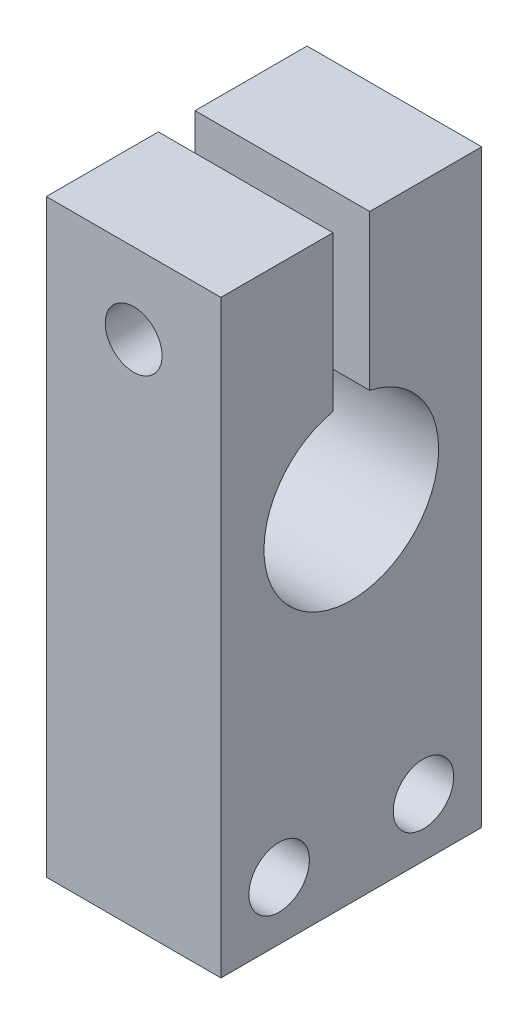
ISO-10303-21;
HEADER;
FILE_DESCRIPTION(('STEP AP214'),'2;1');
FILE_NAME('part.step','',(''),(''),'','','');
FILE_SCHEMA(('AUTOMOTIVE_DESIGN { 1 0 10303 214 1 1 1 1 }'));
ENDSEC;
DATA;
#1=APPLICATION_CONTEXT('core data for automotive mechanical design processes');
#2=APPLICATION_PROTOCOL_DEFINITION('international standard','automotive_design',2000,#1);
#3=PRODUCT_CONTEXT('',#1,'mechanical');
#4=PRODUCT('Part','Part','',(#3));
#5=PRODUCT_RELATED_PRODUCT_CATEGORY('part','',(#4));
#6=PRODUCT_DEFINITION_FORMATION('','',#4);
#7=PRODUCT_DEFINITION_CONTEXT('part definition',#1,'design');
#8=PRODUCT_DEFINITION('design','',#6,#7);
#9=PRODUCT_DEFINITION_SHAPE('','',#8);
#10=(LENGTH_UNIT() NAMED_UNIT(*) SI_UNIT(.MILLI.,.METRE.));
#11=(NAMED_UNIT(*) PLANE_ANGLE_UNIT() SI_UNIT($,.RADIAN.));
#12=(NAMED_UNIT(*) SI_UNIT($,.STERADIAN.) SOLID_ANGLE_UNIT());
#13=UNCERTAINTY_MEASURE_WITH_UNIT(LENGTH_MEASURE(1.E-05),#10,'distance_accuracy_value','');
#14=(GEOMETRIC_REPRESENTATION_CONTEXT(3) GLOBAL_UNCERTAINTY_ASSIGNED_CONTEXT((#13)) GLOBAL_UNIT_ASSIGNED_CONTEXT((#10,
#11,#12)) REPRESENTATION_CONTEXT('',''));
#15=CARTESIAN_POINT('',(0.,0.,0.));
#16=DIRECTION('',(0.,0.,1.));
#17=DIRECTION('',(1.,0.,0.));
#18=AXIS2_PLACEMENT_3D('',#15,#16,#17);
#19=CARTESIAN_POINT('',(-4.7625,13.1064,-15.875));
#20=DIRECTION('',(0.,1.,0.));
#21=DIRECTION('',(0.,0.,1.));
#22=AXIS2_PLACEMENT_3D('',#19,#20,#21);
#23=PLANE('',#22);
#24=DIRECTION('',(-1.,0.,0.));
#25=VECTOR('',#24,1.);
#26=CARTESIAN_POINT('',(4.7625,13.1064,7.112));
#27=LINE('',#26,#25);
#28=CARTESIAN_POINT('',(4.7625,13.1064,7.112));
#29=VERTEX_POINT('',#28);
#30=CARTESIAN_POINT('',(-4.7625,13.1064,7.112));
#31=VERTEX_POINT('',#30);
#32=EDGE_CURVE('E231',#29,#31,#27,.T.);
#33=ORIENTED_EDGE('',*,*,#32,.F.);
#34=DIRECTION('',(0.,0.,1.));
#35=VECTOR('',#34,1.);
#36=CARTESIAN_POINT('',(4.7625,13.1064,-15.875));
#37=LINE('',#36,#35);
#38=CARTESIAN_POINT('',(4.7625,13.1064,1.0033));
#39=VERTEX_POINT('',#38);
#40=EDGE_CURVE('E197',#39,#29,#37,.T.);
#41=ORIENTED_EDGE('',*,*,#40,.F.);
#42=DIRECTION('',(-1.,0.,0.));
#43=VECTOR('',#42,1.);
#44=CARTESIAN_POINT('',(4.7625,13.1064,1.0033));
#45=LINE('',#44,#43);
#46=CARTESIAN_POINT('',(-4.7625,13.1064,1.0033));
#47=VERTEX_POINT('',#46);
#48=EDGE_CURVE('E155',#39,#47,#45,.T.);
#49=ORIENTED_EDGE('',*,*,#48,.T.);
#50=DIRECTION('',(0.,0.,1.));
#51=VECTOR('',#50,1.);
#52=CARTESIAN_POINT('',(-4.7625,13.1064,-15.875));
#53=LINE('',#52,#51);
#54=EDGE_CURVE('E58',#47,#31,#53,.T.);
#55=ORIENTED_EDGE('',*,*,#54,.T.);
#56=EDGE_LOOP('',(#33,#41,#49,#55));
#57=FACE_BOUND('',#56,.T.);
#58=ADVANCED_FACE('F48',(#57),#23,.T.);
#59=CARTESIAN_POINT('',(-4.7625,-19.05,15.875));
#60=DIRECTION('',(0.,-1.,0.));
#61=DIRECTION('',(0.,0.,-1.));
#62=AXIS2_PLACEMENT_3D('',#59,#60,#61);
#63=PLANE('',#62);
#64=DIRECTION('',(1.,0.,0.));
#65=VECTOR('',#64,1.);
#66=CARTESIAN_POINT('',(-4.7625,-19.05,7.112));
#67=LINE('',#66,#65);
#68=CARTESIAN_POINT('',(-4.7625,-19.05,7.112));
#69=VERTEX_POINT('',#68);
#70=CARTESIAN_POINT('',(4.7625,-19.05,7.112));
#71=VERTEX_POINT('',#70);
#72=EDGE_CURVE('E68',#69,#71,#67,.T.);
#73=ORIENTED_EDGE('',*,*,#72,.F.);
#74=DIRECTION('',(0.,0.,-1.));
#75=VECTOR('',#74,1.);
#76=CARTESIAN_POINT('',(-4.7625,-19.05,15.875));
#77=LINE('',#76,#75);
#78=CARTESIAN_POINT('',(-4.7625,-19.05,-7.112));
#79=VERTEX_POINT('',#78);
#80=EDGE_CURVE('E194',#69,#79,#77,.T.);
#81=ORIENTED_EDGE('',*,*,#80,.T.);
#82=DIRECTION('',(-1.,0.,0.));
#83=VECTOR('',#82,1.);
#84=CARTESIAN_POINT('',(4.7625,-19.05,-7.112));
#85=LINE('',#84,#83);
#86=CARTESIAN_POINT('',(4.7625,-19.05,-7.112));
#87=VERTEX_POINT('',#86);
#88=EDGE_CURVE('E183',#87,#79,#85,.T.);
#89=ORIENTED_EDGE('',*,*,#88,.F.);
#90=DIRECTION('',(0.,0.,-1.));
#91=VECTOR('',#90,1.);
#92=CARTESIAN_POINT('',(4.7625,-19.05,15.875));
#93=LINE('',#92,#91);
#94=EDGE_CURVE('E190',#71,#87,#93,.T.);
#95=ORIENTED_EDGE('',*,*,#94,.F.);
#96=EDGE_LOOP('',(#73,#81,#89,#95));
#97=FACE_BOUND('',#96,.T.);
#98=ADVANCED_FACE('F50',(#97),#63,.T.);
#99=DIRECTION('',(-1.,0.,0.));
#100=VECTOR('',#99,1.);
#101=CARTESIAN_POINT('',(4.7625,13.1064,-1.0033));
#102=LINE('',#101,#100);
#103=CARTESIAN_POINT('',(4.7625,13.1064,-1.0033));
#104=VERTEX_POINT('',#103);
#105=CARTESIAN_POINT('',(-4.7625,13.1064,-1.0033));
#106=VERTEX_POINT('',#105);
#107=EDGE_CURVE('E174',#104,#106,#102,.T.);
#108=ORIENTED_EDGE('',*,*,#107,.F.);
#109=CARTESIAN_POINT('',(4.7625,13.1064,-7.112));
#110=VERTEX_POINT('',#109);
#111=EDGE_CURVE('E52',#110,#104,#37,.T.);
#112=ORIENTED_EDGE('',*,*,#111,.F.);
#113=DIRECTION('',(-1.,0.,0.));
#114=VECTOR('',#113,1.);
#115=CARTESIAN_POINT('',(4.7625,13.1064,-7.112));
#116=LINE('',#115,#114);
#117=CARTESIAN_POINT('',(-4.7625,13.1064,-7.112));
#118=VERTEX_POINT('',#117);
#119=EDGE_CURVE('E186',#110,#118,#116,.T.);
#120=ORIENTED_EDGE('',*,*,#119,.T.);
#121=EDGE_CURVE('E11',#118,#106,#53,.T.);
#122=ORIENTED_EDGE('',*,*,#121,.T.);
#123=EDGE_LOOP('',(#108,#112,#120,#122));
#124=FACE_BOUND('',#123,.T.);
#125=ADVANCED_FACE('F211',(#124),#23,.T.);
#126=CARTESIAN_POINT('',(-4.7625,0.,0.));
#127=DIRECTION('',(1.,0.,0.));
#128=DIRECTION('',(0.,0.,-1.));
#129=AXIS2_PLACEMENT_3D('',#126,#127,#128);
#130=PLANE('',#129);
#131=CARTESIAN_POINT('',(-4.7625,-15.875,-3.937));
#132=DIRECTION('',(1.,0.,0.));
#133=DIRECTION('',(0.,0.,-1.));
#134=AXIS2_PLACEMENT_3D('',#131,#132,#133);
#135=CIRCLE('',#134,1.65);
#136=CARTESIAN_POINT('',(-4.7625,-15.875,-5.587));
#137=VERTEX_POINT('',#136);
#138=EDGE_CURVE('E304',#137,#137,#135,.T.);
#139=ORIENTED_EDGE('',*,*,#138,.T.);
#140=EDGE_LOOP('',(#139));
#141=FACE_BOUND('',#140,.T.);
#142=CARTESIAN_POINT('',(-4.7625,-15.875,3.937));
#143=DIRECTION('',(1.,0.,0.));
#144=DIRECTION('',(0.,0.,-1.));
#145=AXIS2_PLACEMENT_3D('',#142,#143,#144);
#146=CIRCLE('',#145,1.65);
#147=CARTESIAN_POINT('',(-4.7625,-15.875,2.28700000000001));
#148=VERTEX_POINT('',#147);
#149=EDGE_CURVE('E307',#148,#148,#146,.T.);
#150=ORIENTED_EDGE('',*,*,#149,.T.);
#151=EDGE_LOOP('',(#150));
#152=FACE_BOUND('',#151,.T.);
#153=DIRECTION('',(0.,1.,0.));
#154=VECTOR('',#153,1.);
#155=CARTESIAN_POINT('',(-4.7625,4.65561976110591,1.0033));
#156=LINE('',#155,#154);
#157=CARTESIAN_POINT('',(-4.7625,4.65561976110591,1.0033));
#158=VERTEX_POINT('',#157);
#159=EDGE_CURVE('E165',#158,#47,#156,.T.);
#160=ORIENTED_EDGE('',*,*,#159,.F.);
#161=CARTESIAN_POINT('',(-4.7625,0.,0.));
#162=DIRECTION('',(1.,0.,0.));
#163=DIRECTION('',(0.,0.,-1.));
#164=AXIS2_PLACEMENT_3D('',#161,#162,#163);
#165=CIRCLE('',#164,4.7625);
#166=CARTESIAN_POINT('',(-4.7625,4.65561976110591,-1.0033));
#167=VERTEX_POINT('',#166);
#168=EDGE_CURVE('E133',#158,#167,#165,.T.);
#169=ORIENTED_EDGE('',*,*,#168,.T.);
#170=DIRECTION('',(0.,-1.,0.));
#171=VECTOR('',#170,1.);
#172=CARTESIAN_POINT('',(-4.7625,13.1064,-1.0033));
#173=LINE('',#172,#171);
#174=EDGE_CURVE('E157',#106,#167,#173,.T.);
#175=ORIENTED_EDGE('',*,*,#174,.F.);
#176=ORIENTED_EDGE('',*,*,#121,.F.);
#177=DIRECTION('',(0.,1.,0.));
#178=VECTOR('',#177,1.);
#179=CARTESIAN_POINT('',(-4.7625,-19.05,-7.112));
#180=LINE('',#179,#178);
#181=EDGE_CURVE('E138',#79,#118,#180,.T.);
#182=ORIENTED_EDGE('',*,*,#181,.F.);
#183=ORIENTED_EDGE('',*,*,#80,.F.);
#184=DIRECTION('',(0.,-1.,0.));
#185=VECTOR('',#184,1.);
#186=CARTESIAN_POINT('',(-4.7625,13.1064,7.112));
#187=LINE('',#186,#185);
#188=EDGE_CURVE('E221',#31,#69,#187,.T.);
#189=ORIENTED_EDGE('',*,*,#188,.F.);
#190=ORIENTED_EDGE('',*,*,#54,.F.);
#191=EDGE_LOOP('',(#160,#169,#175,#176,#182,#183,#189,#190));
#192=FACE_BOUND('',#191,.T.);
#193=ADVANCED_FACE('F217',(#141,#152,#192),#130,.F.);
#194=CARTESIAN_POINT('',(4.7625,0.,0.));
#195=DIRECTION('',(1.,0.,0.));
#196=DIRECTION('',(0.,0.,-1.));
#197=AXIS2_PLACEMENT_3D('',#194,#195,#196);
#198=PLANE('',#197);
#199=CARTESIAN_POINT('',(4.7625,-15.875,-3.937));
#200=DIRECTION('',(1.,0.,0.));
#201=DIRECTION('',(0.,0.,-1.));
#202=AXIS2_PLACEMENT_3D('',#199,#200,#201);
#203=CIRCLE('',#202,1.65);
#204=CARTESIAN_POINT('',(4.7625,-15.875,-5.587));
#205=VERTEX_POINT('',#204);
#206=EDGE_CURVE('E506',#205,#205,#203,.T.);
#207=ORIENTED_EDGE('',*,*,#206,.F.);
#208=EDGE_LOOP('',(#207));
#209=FACE_BOUND('',#208,.T.);
#210=CARTESIAN_POINT('',(4.7625,-15.875,3.937));
#211=DIRECTION('',(1.,0.,0.));
#212=DIRECTION('',(0.,0.,-1.));
#213=AXIS2_PLACEMENT_3D('',#210,#211,#212);
#214=CIRCLE('',#213,1.65);
#215=CARTESIAN_POINT('',(4.7625,-15.875,2.287));
#216=VERTEX_POINT('',#215);
#217=EDGE_CURVE('E311',#216,#216,#214,.T.);
#218=ORIENTED_EDGE('',*,*,#217,.F.);
#219=EDGE_LOOP('',(#218));
#220=FACE_BOUND('',#219,.T.);
#221=CARTESIAN_POINT('',(4.7625,0.,0.));
#222=DIRECTION('',(1.,0.,0.));
#223=DIRECTION('',(0.,0.,-1.));
#224=AXIS2_PLACEMENT_3D('',#221,#222,#223);
#225=CIRCLE('',#224,4.7625);
#226=CARTESIAN_POINT('',(4.7625,4.65561976110591,1.0033));
#227=VERTEX_POINT('',#226);
#228=CARTESIAN_POINT('',(4.7625,4.6556197611059,-1.0033));
#229=VERTEX_POINT('',#228);
#230=EDGE_CURVE('E79',#227,#229,#225,.T.);
#231=ORIENTED_EDGE('',*,*,#230,.F.);
#232=DIRECTION('',(0.,1.,0.));
#233=VECTOR('',#232,1.);
#234=CARTESIAN_POINT('',(4.7625,4.65561976110591,1.0033));
#235=LINE('',#234,#233);
#236=EDGE_CURVE('E146',#227,#39,#235,.T.);
#237=ORIENTED_EDGE('',*,*,#236,.T.);
#238=ORIENTED_EDGE('',*,*,#40,.T.);
#239=DIRECTION('',(0.,-1.,0.));
#240=VECTOR('',#239,1.);
#241=CARTESIAN_POINT('',(4.7625,13.1064,7.112));
#242=LINE('',#241,#240);
#243=EDGE_CURVE('E226',#29,#71,#242,.T.);
#244=ORIENTED_EDGE('',*,*,#243,.T.);
#245=ORIENTED_EDGE('',*,*,#94,.T.);
#246=DIRECTION('',(0.,1.,0.));
#247=VECTOR('',#246,1.);
#248=CARTESIAN_POINT('',(4.7625,-19.05,-7.112));
#249=LINE('',#248,#247);
#250=EDGE_CURVE('E179',#87,#110,#249,.T.);
#251=ORIENTED_EDGE('',*,*,#250,.T.);
#252=ORIENTED_EDGE('',*,*,#111,.T.);
#253=DIRECTION('',(0.,-1.,0.));
#254=VECTOR('',#253,1.);
#255=CARTESIAN_POINT('',(4.7625,13.1064,-1.0033));
#256=LINE('',#255,#254);
#257=EDGE_CURVE('E149',#104,#229,#256,.T.);
#258=ORIENTED_EDGE('',*,*,#257,.T.);
#259=EDGE_LOOP('',(#231,#237,#238,#244,#245,#251,#252,#258));
#260=FACE_BOUND('',#259,.T.);
#261=ADVANCED_FACE('F144',(#209,#220,#260),#198,.T.);
#262=CARTESIAN_POINT('',(4.7625,-19.05,-7.112));
#263=DIRECTION('',(0.,0.,1.));
#264=DIRECTION('',(1.,0.,0.));
#265=AXIS2_PLACEMENT_3D('',#262,#263,#264);
#266=PLANE('',#265);
#267=CARTESIAN_POINT('',(0.,8.7376,-7.112));
#268=DIRECTION('',(0.,0.,-1.));
#269=DIRECTION('',(-1.,0.,0.));
#270=AXIS2_PLACEMENT_3D('',#267,#268,#269);
#271=CIRCLE('',#270,3.64);
#272=CARTESIAN_POINT('',(-3.64,8.7376,-7.112));
#273=VERTEX_POINT('',#272);
#274=EDGE_CURVE('E310',#273,#273,#271,.T.);
#275=ORIENTED_EDGE('',*,*,#274,.F.);
#276=EDGE_LOOP('',(#275));
#277=FACE_BOUND('',#276,.T.);
#278=ORIENTED_EDGE('',*,*,#181,.T.);
#279=ORIENTED_EDGE('',*,*,#119,.F.);
#280=ORIENTED_EDGE('',*,*,#250,.F.);
#281=ORIENTED_EDGE('',*,*,#88,.T.);
#282=EDGE_LOOP('',(#278,#279,#280,#281));
#283=FACE_BOUND('',#282,.T.);
#284=ADVANCED_FACE('F276',(#277,#283),#266,.F.);
#285=CARTESIAN_POINT('',(4.7625,4.65561976110591,1.0033));
#286=DIRECTION('',(0.,0.,1.));
#287=DIRECTION('',(1.,0.,0.));
#288=AXIS2_PLACEMENT_3D('',#285,#286,#287);
#289=PLANE('',#288);
#290=CARTESIAN_POINT('',(0.,8.7376,1.0033));
#291=DIRECTION('',(0.,0.,1.));
#292=DIRECTION('',(1.,0.,0.));
#293=AXIS2_PLACEMENT_3D('',#290,#291,#292);
#294=CIRCLE('',#293,1.55);
#295=CARTESIAN_POINT('',(1.55,8.7376,1.0033));
#296=VERTEX_POINT('',#295);
#297=EDGE_CURVE('E335',#296,#296,#294,.T.);
#298=ORIENTED_EDGE('',*,*,#297,.T.);
#299=EDGE_LOOP('',(#298));
#300=FACE_BOUND('',#299,.T.);
#301=ORIENTED_EDGE('',*,*,#159,.T.);
#302=ORIENTED_EDGE('',*,*,#48,.F.);
#303=ORIENTED_EDGE('',*,*,#236,.F.);
#304=DIRECTION('',(-1.,0.,0.));
#305=VECTOR('',#304,1.);
#306=CARTESIAN_POINT('',(4.7625,4.65561976110591,1.0033));
#307=LINE('',#306,#305);
#308=EDGE_CURVE('E130',#227,#158,#307,.T.);
#309=ORIENTED_EDGE('',*,*,#308,.T.);
#310=EDGE_LOOP('',(#301,#302,#303,#309));
#311=FACE_BOUND('',#310,.T.);
#312=ADVANCED_FACE('F153',(#300,#311),#289,.F.);
#313=CARTESIAN_POINT('',(4.7625,13.1064,-1.0033));
#314=DIRECTION('',(0.,0.,-1.));
#315=DIRECTION('',(-1.,0.,0.));
#316=AXIS2_PLACEMENT_3D('',#313,#314,#315);
#317=PLANE('',#316);
#318=CARTESIAN_POINT('',(0.,8.7376,-1.0033));
#319=DIRECTION('',(0.,0.,-1.));
#320=DIRECTION('',(-1.,0.,0.));
#321=AXIS2_PLACEMENT_3D('',#318,#319,#320);
#322=CIRCLE('',#321,1.55);
#323=CARTESIAN_POINT('',(-1.55,8.7376,-1.0033));
#324=VERTEX_POINT('',#323);
#325=EDGE_CURVE('E151',#324,#324,#322,.T.);
#326=ORIENTED_EDGE('',*,*,#325,.T.);
#327=EDGE_LOOP('',(#326));
#328=FACE_BOUND('',#327,.T.);
#329=ORIENTED_EDGE('',*,*,#174,.T.);
#330=DIRECTION('',(-1.,0.,0.));
#331=VECTOR('',#330,1.);
#332=CARTESIAN_POINT('',(4.7625,4.6556197611059,-1.0033));
#333=LINE('',#332,#331);
#334=EDGE_CURVE('E139',#229,#167,#333,.T.);
#335=ORIENTED_EDGE('',*,*,#334,.F.);
#336=ORIENTED_EDGE('',*,*,#257,.F.);
#337=ORIENTED_EDGE('',*,*,#107,.T.);
#338=EDGE_LOOP('',(#329,#335,#336,#337));
#339=FACE_BOUND('',#338,.T.);
#340=ADVANCED_FACE('F215',(#328,#339),#317,.F.);
#341=CARTESIAN_POINT('',(4.7625,13.1064,7.112));
#342=DIRECTION('',(0.,0.,-1.));
#343=DIRECTION('',(0.,1.,0.));
#344=AXIS2_PLACEMENT_3D('',#341,#342,#343);
#345=PLANE('',#344);
#346=CARTESIAN_POINT('',(0.,8.7376,7.112));
#347=DIRECTION('',(0.,0.,-1.));
#348=DIRECTION('',(-1.,0.,0.));
#349=AXIS2_PLACEMENT_3D('',#346,#347,#348);
#350=CIRCLE('',#349,1.55);
#351=CARTESIAN_POINT('',(-1.55,8.7376,7.112));
#352=VERTEX_POINT('',#351);
#353=EDGE_CURVE('E331',#352,#352,#350,.T.);
#354=ORIENTED_EDGE('',*,*,#353,.T.);
#355=EDGE_LOOP('',(#354));
#356=FACE_BOUND('',#355,.T.);
#357=ORIENTED_EDGE('',*,*,#72,.T.);
#358=ORIENTED_EDGE('',*,*,#243,.F.);
#359=ORIENTED_EDGE('',*,*,#32,.T.);
#360=ORIENTED_EDGE('',*,*,#188,.T.);
#361=EDGE_LOOP('',(#357,#358,#359,#360));
#362=FACE_BOUND('',#361,.T.);
#363=ADVANCED_FACE('F272',(#356,#362),#345,.F.);
#364=CARTESIAN_POINT('',(-4.7625,0.,0.));
#365=DIRECTION('',(1.,0.,0.));
#366=DIRECTION('',(0.,0.,-1.));
#367=AXIS2_PLACEMENT_3D('',#364,#365,#366);
#368=CYLINDRICAL_SURFACE('',#367,4.7625);
#369=ORIENTED_EDGE('',*,*,#230,.T.);
#370=ORIENTED_EDGE('',*,*,#334,.T.);
#371=ORIENTED_EDGE('',*,*,#168,.F.);
#372=ORIENTED_EDGE('',*,*,#308,.F.);
#373=EDGE_LOOP('',(#369,#370,#371,#372));
#374=FACE_BOUND('',#373,.T.);
#375=ADVANCED_FACE('F131',(#374),#368,.F.);
#376=CARTESIAN_POINT('',(0.,8.7376,-7.112));
#377=DIRECTION('',(0.,0.,-1.));
#378=DIRECTION('',(-1.,0.,0.));
#379=AXIS2_PLACEMENT_3D('',#376,#377,#378);
#380=CYLINDRICAL_SURFACE('',#379,1.55);
#381=ORIENTED_EDGE('',*,*,#353,.F.);
#382=EDGE_LOOP('',(#381));
#383=FACE_BOUND('',#382,.T.);
#384=ORIENTED_EDGE('',*,*,#297,.F.);
#385=EDGE_LOOP('',(#384));
#386=FACE_BOUND('',#385,.T.);
#387=ADVANCED_FACE('F348',(#383,#386),#380,.F.);
#388=CARTESIAN_POINT('',(0.,8.7376,-5.012));
#389=DIRECTION('',(0.,0.,-1.));
#390=DIRECTION('',(-1.,0.,0.));
#391=AXIS2_PLACEMENT_3D('',#388,#389,#390);
#392=CIRCLE('',#391,1.55);
#393=CARTESIAN_POINT('',(-1.55,8.7376,-5.012));
#394=VERTEX_POINT('',#393);
#395=EDGE_CURVE('E327',#394,#394,#392,.T.);
#396=ORIENTED_EDGE('',*,*,#395,.T.);
#397=EDGE_LOOP('',(#396));
#398=FACE_BOUND('',#397,.T.);
#399=ORIENTED_EDGE('',*,*,#325,.F.);
#400=EDGE_LOOP('',(#399));
#401=FACE_BOUND('',#400,.T.);
#402=ADVANCED_FACE('F345',(#398,#401),#380,.F.);
#403=CARTESIAN_POINT('',(1.55,8.7376,-5.012));
#404=DIRECTION('',(0.,0.,1.));
#405=DIRECTION('',(1.,0.,0.));
#406=AXIS2_PLACEMENT_3D('',#403,#404,#405);
#407=PLANE('',#406);
#408=ORIENTED_EDGE('',*,*,#395,.F.);
#409=EDGE_LOOP('',(#408));
#410=FACE_BOUND('',#409,.T.);
#411=CARTESIAN_POINT('',(0.,8.7376,-5.012));
#412=DIRECTION('',(0.,0.,-1.));
#413=DIRECTION('',(-1.,0.,0.));
#414=AXIS2_PLACEMENT_3D('',#411,#412,#413);
#415=CIRCLE('',#414,3.64);
#416=CARTESIAN_POINT('',(-3.64,8.7376,-5.012));
#417=VERTEX_POINT('',#416);
#418=EDGE_CURVE('E318',#417,#417,#415,.T.);
#419=ORIENTED_EDGE('',*,*,#418,.T.);
#420=EDGE_LOOP('',(#419));
#421=FACE_BOUND('',#420,.T.);
#422=ADVANCED_FACE('F347',(#410,#421),#407,.F.);
#423=CARTESIAN_POINT('',(0.,8.7376,-7.112));
#424=DIRECTION('',(0.,0.,-1.));
#425=DIRECTION('',(-1.,0.,0.));
#426=AXIS2_PLACEMENT_3D('',#423,#424,#425);
#427=CYLINDRICAL_SURFACE('',#426,3.64);
#428=ORIENTED_EDGE('',*,*,#418,.F.);
#429=EDGE_LOOP('',(#428));
#430=FACE_BOUND('',#429,.T.);
#431=ORIENTED_EDGE('',*,*,#274,.T.);
#432=EDGE_LOOP('',(#431));
#433=FACE_BOUND('',#432,.T.);
#434=ADVANCED_FACE('F355',(#430,#433),#427,.F.);
#435=CARTESIAN_POINT('',(4.7625,-15.875,3.937));
#436=DIRECTION('',(1.,0.,0.));
#437=DIRECTION('',(0.,0.,-1.));
#438=AXIS2_PLACEMENT_3D('',#435,#436,#437);
#439=CYLINDRICAL_SURFACE('',#438,1.65);
#440=ORIENTED_EDGE('',*,*,#149,.F.);
#441=EDGE_LOOP('',(#440));
#442=FACE_BOUND('',#441,.T.);
#443=ORIENTED_EDGE('',*,*,#217,.T.);
#444=EDGE_LOOP('',(#443));
#445=FACE_BOUND('',#444,.T.);
#446=ADVANCED_FACE('F442',(#442,#445),#439,.F.);
#447=CARTESIAN_POINT('',(4.7625,-15.875,-3.937));
#448=DIRECTION('',(1.,0.,0.));
#449=DIRECTION('',(0.,0.,-1.));
#450=AXIS2_PLACEMENT_3D('',#447,#448,#449);
#451=CYLINDRICAL_SURFACE('',#450,1.65);
#452=ORIENTED_EDGE('',*,*,#138,.F.);
#453=EDGE_LOOP('',(#452));
#454=FACE_BOUND('',#453,.T.);
#455=ORIENTED_EDGE('',*,*,#206,.T.);
#456=EDGE_LOOP('',(#455));
#457=FACE_BOUND('',#456,.T.);
#458=ADVANCED_FACE('F480',(#454,#457),#451,.F.);
#459=CLOSED_SHELL('',(#58,#98,#125,#193,#261,#284,#312,#340,#363,#375,#387,#402,#422,#434,#446,#458));
#460=MANIFOLD_SOLID_BREP('B2',#459);
#461=ADVANCED_BREP_SHAPE_REPRESENTATION('',(#18,#460),#14);
#462=SHAPE_DEFINITION_REPRESENTATION(#9,#461);
ENDSEC;
END-ISO-10303-21;
